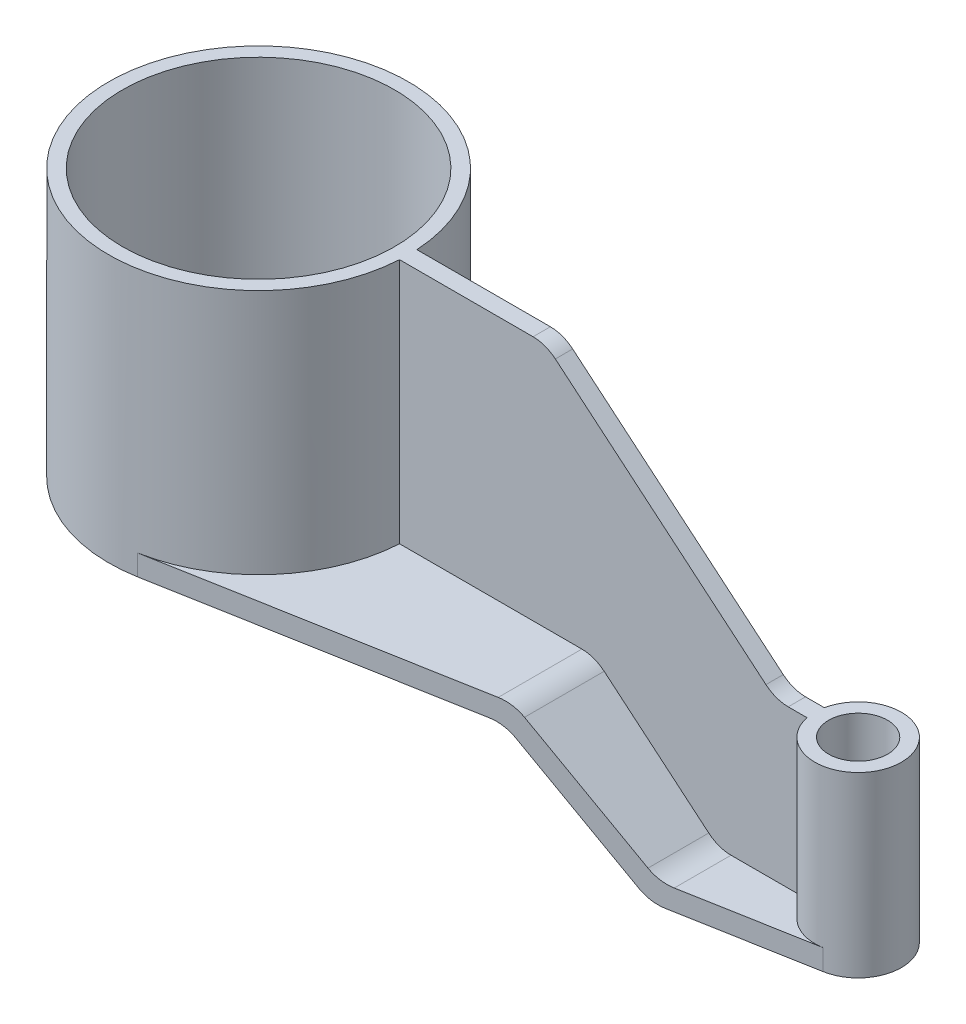
ISO-10303-21;
HEADER;
FILE_DESCRIPTION(('STEP AP214'),'2;1');
FILE_NAME('part.step','',(''),(''),'','','');
FILE_SCHEMA(('AUTOMOTIVE_DESIGN { 1 0 10303 214 1 1 1 1 }'));
ENDSEC;
DATA;
#1=APPLICATION_CONTEXT('core data for automotive mechanical design processes');
#2=APPLICATION_PROTOCOL_DEFINITION('international standard','automotive_design',2000,#1);
#3=PRODUCT_CONTEXT('',#1,'mechanical');
#4=PRODUCT('Part','Part','',(#3));
#5=PRODUCT_RELATED_PRODUCT_CATEGORY('part','',(#4));
#6=PRODUCT_DEFINITION_FORMATION('','',#4);
#7=PRODUCT_DEFINITION_CONTEXT('part definition',#1,'design');
#8=PRODUCT_DEFINITION('design','',#6,#7);
#9=PRODUCT_DEFINITION_SHAPE('','',#8);
#10=(LENGTH_UNIT() NAMED_UNIT(*) SI_UNIT(.MILLI.,.METRE.));
#11=(NAMED_UNIT(*) PLANE_ANGLE_UNIT() SI_UNIT($,.RADIAN.));
#12=(NAMED_UNIT(*) SI_UNIT($,.STERADIAN.) SOLID_ANGLE_UNIT());
#13=UNCERTAINTY_MEASURE_WITH_UNIT(LENGTH_MEASURE(1.E-05),#10,'distance_accuracy_value','');
#14=(GEOMETRIC_REPRESENTATION_CONTEXT(3) GLOBAL_UNCERTAINTY_ASSIGNED_CONTEXT((#13)) GLOBAL_UNIT_ASSIGNED_CONTEXT((#10,
#11,#12)) REPRESENTATION_CONTEXT('',''));
#15=CARTESIAN_POINT('',(0.,0.,0.));
#16=DIRECTION('',(0.,0.,1.));
#17=DIRECTION('',(1.,0.,0.));
#18=AXIS2_PLACEMENT_3D('',#15,#16,#17);
#19=CARTESIAN_POINT('',(-43.25,6.,115.));
#20=DIRECTION('',(0.,-1.,0.));
#21=DIRECTION('',(1.,0.,0.));
#22=AXIS2_PLACEMENT_3D('',#19,#20,#21);
#23=PLANE('',#22);
#24=DIRECTION('',(-1.,0.,0.));
#25=VECTOR('',#24,1.);
#26=CARTESIAN_POINT('',(-43.25,6.,-2.5));
#27=LINE('',#26,#25);
#28=CARTESIAN_POINT('',(95.7915112851085,6.,-2.5));
#29=VERTEX_POINT('',#28);
#30=CARTESIAN_POINT('',(43.1776852089132,6.00000000000001,-2.5));
#31=VERTEX_POINT('',#30);
#32=EDGE_CURVE('E239',#29,#31,#27,.T.);
#33=ORIENTED_EDGE('',*,*,#32,.F.);
#34=DIRECTION('',(0.,0.,-1.));
#35=VECTOR('',#34,1.);
#36=CARTESIAN_POINT('',(95.7915112851085,6.,115.));
#37=LINE('',#36,#35);
#38=CARTESIAN_POINT('',(95.7915112851085,6.,-26.6478014893455));
#39=VERTEX_POINT('',#38);
#40=EDGE_CURVE('E357',#29,#39,#37,.T.);
#41=ORIENTED_EDGE('',*,*,#40,.T.);
#42=DIRECTION('',(-0.984076459766301,0.,-0.177745664739884));
#43=VECTOR('',#42,1.);
#44=CARTESIAN_POINT('',(-14.0808178852683,6.,-46.4931397159563));
#45=LINE('',#44,#43);
#46=CARTESIAN_POINT('',(7.6875,5.99999999999999,-42.5613068848925));
#47=VERTEX_POINT('',#46);
#48=EDGE_CURVE('E286',#39,#47,#45,.T.);
#49=ORIENTED_EDGE('',*,*,#48,.T.);
#50=CARTESIAN_POINT('',(0.,6.00000000000001,0.));
#51=DIRECTION('',(0.,-1.,0.));
#52=DIRECTION('',(1.,0.,0.));
#53=AXIS2_PLACEMENT_3D('',#50,#51,#52);
#54=CIRCLE('',#53,43.25);
#55=EDGE_CURVE('E305',#47,#31,#54,.T.);
#56=ORIENTED_EDGE('',*,*,#55,.T.);
#57=EDGE_LOOP('',(#33,#41,#49,#56));
#58=FACE_BOUND('',#57,.T.);
#59=ADVANCED_FACE('F37',(#58),#23,.F.);
#60=CARTESIAN_POINT('',(185.5,-24.,115.));
#61=DIRECTION('',(0.,-1.,0.));
#62=DIRECTION('',(1.,0.,0.));
#63=AXIS2_PLACEMENT_3D('',#60,#61,#62);
#64=PLANE('',#63);
#65=DIRECTION('',(-0.984076459766301,0.,-0.177745664739884));
#66=VECTOR('',#65,1.);
#67=CARTESIAN_POINT('',(207.44216410962,-24.,-6.48125923748866));
#68=LINE('',#67,#66);
#69=CARTESIAN_POINT('',(175.221820809249,-24.,-12.3009557470788));
#70=VERTEX_POINT('',#69);
#71=CARTESIAN_POINT('',(138.823523748259,-24.,-18.875281798981));
#72=VERTEX_POINT('',#71);
#73=EDGE_CURVE('E283',#70,#72,#68,.T.);
#74=ORIENTED_EDGE('',*,*,#73,.T.);
#75=DIRECTION('',(0.,0.,-1.));
#76=VECTOR('',#75,1.);
#77=CARTESIAN_POINT('',(138.823523748259,-24.,-2.5));
#78=LINE('',#77,#76);
#79=CARTESIAN_POINT('',(138.823523748259,-24.,-2.5));
#80=VERTEX_POINT('',#79);
#81=EDGE_CURVE('E364',#72,#80,#78,.F.);
#82=ORIENTED_EDGE('',*,*,#81,.T.);
#83=DIRECTION('',(-1.,0.,0.));
#84=VECTOR('',#83,1.);
#85=CARTESIAN_POINT('',(185.5,-24.,-2.5));
#86=LINE('',#85,#84);
#87=CARTESIAN_POINT('',(160.752551286084,-24.,-2.5));
#88=VERTEX_POINT('',#87);
#89=EDGE_CURVE('E228',#88,#80,#86,.T.);
#90=ORIENTED_EDGE('',*,*,#89,.F.);
#91=CARTESIAN_POINT('',(173.,-24.,0.));
#92=DIRECTION('',(0.,-1.,0.));
#93=DIRECTION('',(1.,0.,0.));
#94=AXIS2_PLACEMENT_3D('',#91,#92,#93);
#95=CIRCLE('',#94,12.5);
#96=EDGE_CURVE('E227',#70,#88,#95,.F.);
#97=ORIENTED_EDGE('',*,*,#96,.F.);
#98=EDGE_LOOP('',(#74,#82,#90,#97));
#99=FACE_BOUND('',#98,.T.);
#100=ADVANCED_FACE('F467',(#99),#64,.F.);
#101=CARTESIAN_POINT('',(136.856725658119,-25.4037333412861,115.));
#102=DIRECTION('',(-0.642787609686535,-0.766044443118982,0.));
#103=DIRECTION('',(0.766044443118982,-0.642787609686535,0.));
#104=AXIS2_PLACEMENT_3D('',#101,#102,#103);
#105=PLANE('',#104);
#106=DIRECTION('',(-0.758815239000417,0.636721587176942,-0.137058576833465));
#107=VECTOR('',#106,1.);
#108=CARTESIAN_POINT('',(150.816987428788,-37.1177838441927,-16.7090007612906));
#109=LINE('',#108,#107);
#110=CARTESIAN_POINT('',(132.395647651394,-21.6604444311898,-20.0362963709324));
#111=VERTEX_POINT('',#110);
#112=CARTESIAN_POINT('',(102.219387381974,3.66044443118979,-25.4867869173942));
#113=VERTEX_POINT('',#112);
#114=EDGE_CURVE('E281',#111,#113,#109,.T.);
#115=ORIENTED_EDGE('',*,*,#114,.T.);
#116=DIRECTION('',(0.,0.,-1.));
#117=VECTOR('',#116,1.);
#118=CARTESIAN_POINT('',(102.219387381974,3.66044443118982,115.));
#119=LINE('',#118,#117);
#120=CARTESIAN_POINT('',(102.219387381974,3.66044443118982,-2.5));
#121=VERTEX_POINT('',#120);
#122=EDGE_CURVE('E52',#113,#121,#119,.F.);
#123=ORIENTED_EDGE('',*,*,#122,.T.);
#124=DIRECTION('',(-0.766044443118982,0.642787609686535,0.));
#125=VECTOR('',#124,1.);
#126=CARTESIAN_POINT('',(136.856725658119,-25.4037333412861,-2.5));
#127=LINE('',#126,#125);
#128=CARTESIAN_POINT('',(132.395647651394,-21.6604444311898,-2.5));
#129=VERTEX_POINT('',#128);
#130=EDGE_CURVE('E231',#129,#121,#127,.T.);
#131=ORIENTED_EDGE('',*,*,#130,.F.);
#132=DIRECTION('',(0.,0.,-1.));
#133=VECTOR('',#132,1.);
#134=CARTESIAN_POINT('',(132.395647651394,-21.6604444311898,-19.5326913995576));
#135=LINE('',#134,#133);
#136=EDGE_CURVE('E360',#129,#111,#135,.T.);
#137=ORIENTED_EDGE('',*,*,#136,.T.);
#138=EDGE_LOOP('',(#115,#123,#131,#137));
#139=FACE_BOUND('',#138,.T.);
#140=ADVANCED_FACE('F459',(#139),#105,.F.);
#141=CARTESIAN_POINT('',(0.,77.,0.));
#142=DIRECTION('',(0.,1.,0.));
#143=DIRECTION('',(0.,0.,1.));
#144=AXIS2_PLACEMENT_3D('',#141,#142,#143);
#145=PLANE('',#144);
#146=CARTESIAN_POINT('',(0.,77.,0.));
#147=DIRECTION('',(0.,1.,0.));
#148=DIRECTION('',(0.,0.,1.));
#149=AXIS2_PLACEMENT_3D('',#146,#147,#148);
#150=CIRCLE('',#149,39.25);
#151=CARTESIAN_POINT('',(0.,77.,39.25));
#152=VERTEX_POINT('',#151);
#153=EDGE_CURVE('E320',#152,#152,#150,.T.);
#154=ORIENTED_EDGE('',*,*,#153,.F.);
#155=EDGE_LOOP('',(#154));
#156=FACE_BOUND('',#155,.T.);
#157=DIRECTION('',(1.,0.,0.));
#158=VECTOR('',#157,1.);
#159=CARTESIAN_POINT('',(71.125,77.,2.5));
#160=LINE('',#159,#158);
#161=CARTESIAN_POINT('',(81.703153028591,77.,2.5));
#162=VERTEX_POINT('',#161);
#163=CARTESIAN_POINT('',(43.1776852089132,77.,2.5));
#164=VERTEX_POINT('',#163);
#165=EDGE_CURVE('E229',#162,#164,#160,.F.);
#166=ORIENTED_EDGE('',*,*,#165,.F.);
#167=DIRECTION('',(0.,0.,1.));
#168=VECTOR('',#167,1.);
#169=CARTESIAN_POINT('',(81.703153028591,77.,0.));
#170=LINE('',#169,#168);
#171=CARTESIAN_POINT('',(81.703153028591,77.,-2.5));
#172=VERTEX_POINT('',#171);
#173=EDGE_CURVE('E350',#162,#172,#170,.F.);
#174=ORIENTED_EDGE('',*,*,#173,.T.);
#175=DIRECTION('',(1.,0.,0.));
#176=VECTOR('',#175,1.);
#177=CARTESIAN_POINT('',(71.125,77.,-2.5));
#178=LINE('',#177,#176);
#179=CARTESIAN_POINT('',(43.1776852089132,77.,-2.5));
#180=VERTEX_POINT('',#179);
#181=EDGE_CURVE('E236',#172,#180,#178,.F.);
#182=ORIENTED_EDGE('',*,*,#181,.T.);
#183=CARTESIAN_POINT('',(0.,77.,0.));
#184=DIRECTION('',(0.,1.,0.));
#185=DIRECTION('',(0.,0.,1.));
#186=AXIS2_PLACEMENT_3D('',#183,#184,#185);
#187=CIRCLE('',#186,43.25);
#188=EDGE_CURVE('E211',#180,#164,#187,.T.);
#189=ORIENTED_EDGE('',*,*,#188,.T.);
#190=EDGE_LOOP('',(#166,#174,#182,#189));
#191=FACE_BOUND('',#190,.T.);
#192=ADVANCED_FACE('F451',(#156,#191),#145,.T.);
#193=DIRECTION('',(-0.984076459766301,0.,0.177745664739884));
#194=VECTOR('',#193,1.);
#195=CARTESIAN_POINT('',(-54.311342519356,6.,53.7596496227356));
#196=LINE('',#195,#194);
#197=CARTESIAN_POINT('',(95.7915112851085,6.,26.6478014893455));
#198=VERTEX_POINT('',#197);
#199=CARTESIAN_POINT('',(7.6875,5.99999999999999,42.5613068848925));
#200=VERTEX_POINT('',#199);
#201=EDGE_CURVE('E300',#198,#200,#196,.T.);
#202=ORIENTED_EDGE('',*,*,#201,.F.);
#203=DIRECTION('',(0.,0.,-1.));
#204=VECTOR('',#203,1.);
#205=CARTESIAN_POINT('',(95.7915112851085,6.,115.));
#206=LINE('',#205,#204);
#207=CARTESIAN_POINT('',(95.7915112851085,6.,2.5));
#208=VERTEX_POINT('',#207);
#209=EDGE_CURVE('E373',#198,#208,#206,.T.);
#210=ORIENTED_EDGE('',*,*,#209,.T.);
#211=DIRECTION('',(-1.,0.,0.));
#212=VECTOR('',#211,1.);
#213=CARTESIAN_POINT('',(-43.25,6.,2.5));
#214=LINE('',#213,#212);
#215=CARTESIAN_POINT('',(43.1776852089132,6.00000000000001,2.5));
#216=VERTEX_POINT('',#215);
#217=EDGE_CURVE('E252',#208,#216,#214,.T.);
#218=ORIENTED_EDGE('',*,*,#217,.T.);
#219=EDGE_CURVE('E304',#216,#200,#54,.T.);
#220=ORIENTED_EDGE('',*,*,#219,.T.);
#221=EDGE_LOOP('',(#202,#210,#218,#220));
#222=FACE_BOUND('',#221,.T.);
#223=ADVANCED_FACE('F443',(#222),#23,.F.);
#224=DIRECTION('',(-1.,0.,0.));
#225=VECTOR('',#224,1.);
#226=CARTESIAN_POINT('',(185.5,-24.,2.5));
#227=LINE('',#226,#225);
#228=CARTESIAN_POINT('',(160.752551286084,-24.,2.5));
#229=VERTEX_POINT('',#228);
#230=CARTESIAN_POINT('',(138.823523748259,-24.,2.5));
#231=VERTEX_POINT('',#230);
#232=EDGE_CURVE('E246',#229,#231,#227,.T.);
#233=ORIENTED_EDGE('',*,*,#232,.T.);
#234=DIRECTION('',(0.,0.,-1.));
#235=VECTOR('',#234,1.);
#236=CARTESIAN_POINT('',(138.823523748259,-24.,19.5326913995576));
#237=LINE('',#236,#235);
#238=CARTESIAN_POINT('',(138.823523748259,-24.,18.875281798981));
#239=VERTEX_POINT('',#238);
#240=EDGE_CURVE('E371',#231,#239,#237,.F.);
#241=ORIENTED_EDGE('',*,*,#240,.T.);
#242=DIRECTION('',(-0.984076459766301,0.,0.177745664739884));
#243=VECTOR('',#242,1.);
#244=CARTESIAN_POINT('',(167.211639475532,-24.,13.747769144268));
#245=LINE('',#244,#243);
#246=CARTESIAN_POINT('',(175.221820809248,-24.,12.3009557470788));
#247=VERTEX_POINT('',#246);
#248=EDGE_CURVE('E297',#247,#239,#245,.T.);
#249=ORIENTED_EDGE('',*,*,#248,.F.);
#250=EDGE_CURVE('E308',#229,#247,#95,.F.);
#251=ORIENTED_EDGE('',*,*,#250,.F.);
#252=EDGE_LOOP('',(#233,#241,#249,#251));
#253=FACE_BOUND('',#252,.T.);
#254=ADVANCED_FACE('F406',(#253),#64,.F.);
#255=DIRECTION('',(-0.758815239000417,0.636721587176942,0.137058576833465));
#256=VECTOR('',#255,1.);
#257=CARTESIAN_POINT('',(126.896495979291,-17.0461082913409,21.0295630625219));
#258=LINE('',#257,#256);
#259=CARTESIAN_POINT('',(132.395647651394,-21.6604444311898,20.0362963709323));
#260=VERTEX_POINT('',#259);
#261=CARTESIAN_POINT('',(102.219387381974,3.6604444311898,25.4867869173941));
#262=VERTEX_POINT('',#261);
#263=EDGE_CURVE('E294',#260,#262,#258,.T.);
#264=ORIENTED_EDGE('',*,*,#263,.F.);
#265=DIRECTION('',(0.,0.,-1.));
#266=VECTOR('',#265,1.);
#267=CARTESIAN_POINT('',(132.395647651394,-21.6604444311898,2.5));
#268=LINE('',#267,#266);
#269=CARTESIAN_POINT('',(132.395647651394,-21.6604444311898,2.5));
#270=VERTEX_POINT('',#269);
#271=EDGE_CURVE('E368',#260,#270,#268,.T.);
#272=ORIENTED_EDGE('',*,*,#271,.T.);
#273=DIRECTION('',(-0.766044443118982,0.642787609686535,0.));
#274=VECTOR('',#273,1.);
#275=CARTESIAN_POINT('',(136.856725658119,-25.4037333412861,2.5));
#276=LINE('',#275,#274);
#277=CARTESIAN_POINT('',(102.219387381974,3.66044443118982,2.5));
#278=VERTEX_POINT('',#277);
#279=EDGE_CURVE('E249',#270,#278,#276,.T.);
#280=ORIENTED_EDGE('',*,*,#279,.T.);
#281=DIRECTION('',(0.,0.,-1.));
#282=VECTOR('',#281,1.);
#283=CARTESIAN_POINT('',(102.219387381974,3.66044443118982,115.));
#284=LINE('',#283,#282);
#285=EDGE_CURVE('E366',#278,#262,#284,.F.);
#286=ORIENTED_EDGE('',*,*,#285,.T.);
#287=EDGE_LOOP('',(#264,#272,#280,#286));
#288=FACE_BOUND('',#287,.T.);
#289=ADVANCED_FACE('F397',(#288),#105,.F.);
#290=CARTESIAN_POINT('',(0.,77.,0.));
#291=DIRECTION('',(0.,-1.,0.));
#292=DIRECTION('',(0.,0.,-1.));
#293=AXIS2_PLACEMENT_3D('',#290,#291,#292);
#294=CYLINDRICAL_SURFACE('',#293,43.25);
#295=DIRECTION('',(0.,-1.,0.));
#296=VECTOR('',#295,1.);
#297=CARTESIAN_POINT('',(43.1776852089132,77.,2.5));
#298=LINE('',#297,#296);
#299=EDGE_CURVE('E254',#216,#164,#298,.F.);
#300=ORIENTED_EDGE('',*,*,#299,.T.);
#301=ORIENTED_EDGE('',*,*,#188,.F.);
#302=DIRECTION('',(0.,-1.,0.));
#303=VECTOR('',#302,1.);
#304=CARTESIAN_POINT('',(43.1776852089132,77.,-2.5));
#305=LINE('',#304,#303);
#306=EDGE_CURVE('E241',#31,#180,#305,.F.);
#307=ORIENTED_EDGE('',*,*,#306,.F.);
#308=ORIENTED_EDGE('',*,*,#55,.F.);
#309=DIRECTION('',(0.,1.,0.));
#310=VECTOR('',#309,1.);
#311=CARTESIAN_POINT('',(7.6875,-30.,-42.5613068848925));
#312=LINE('',#311,#310);
#313=CARTESIAN_POINT('',(7.6875,0.,-42.5613068848925));
#314=VERTEX_POINT('',#313);
#315=EDGE_CURVE('E272',#314,#47,#312,.T.);
#316=ORIENTED_EDGE('',*,*,#315,.F.);
#317=CARTESIAN_POINT('',(0.,0.,0.));
#318=DIRECTION('',(0.,1.,0.));
#319=DIRECTION('',(0.,0.,1.));
#320=AXIS2_PLACEMENT_3D('',#317,#318,#319);
#321=CIRCLE('',#320,43.25);
#322=CARTESIAN_POINT('',(7.6875,0.,42.5613068848925));
#323=VERTEX_POINT('',#322);
#324=EDGE_CURVE('E313',#314,#323,#321,.T.);
#325=ORIENTED_EDGE('',*,*,#324,.T.);
#326=DIRECTION('',(0.,1.,0.));
#327=VECTOR('',#326,1.);
#328=CARTESIAN_POINT('',(7.6875,-30.,42.5613068848925));
#329=LINE('',#328,#327);
#330=EDGE_CURVE('E269',#323,#200,#329,.T.);
#331=ORIENTED_EDGE('',*,*,#330,.T.);
#332=ORIENTED_EDGE('',*,*,#219,.F.);
#333=EDGE_LOOP('',(#300,#301,#307,#308,#316,#325,#331,#332));
#334=FACE_BOUND('',#333,.T.);
#335=ADVANCED_FACE('F436',(#334),#294,.T.);
#336=CARTESIAN_POINT('',(173.,21.3333333333333,0.));
#337=DIRECTION('',(0.,-1.,0.));
#338=DIRECTION('',(0.,0.,-1.));
#339=AXIS2_PLACEMENT_3D('',#336,#337,#338);
#340=CYLINDRICAL_SURFACE('',#339,12.5);
#341=CARTESIAN_POINT('',(173.,21.3333333333333,0.));
#342=DIRECTION('',(0.,1.,0.));
#343=DIRECTION('',(0.,0.,1.));
#344=AXIS2_PLACEMENT_3D('',#341,#342,#343);
#345=CIRCLE('',#344,12.5);
#346=CARTESIAN_POINT('',(160.752551286084,21.3333333333333,2.5));
#347=VERTEX_POINT('',#346);
#348=CARTESIAN_POINT('',(160.752551286084,21.3333333333333,-2.5));
#349=VERTEX_POINT('',#348);
#350=EDGE_CURVE('E199',#347,#349,#345,.T.);
#351=ORIENTED_EDGE('',*,*,#350,.F.);
#352=DIRECTION('',(0.,-1.,0.));
#353=VECTOR('',#352,1.);
#354=CARTESIAN_POINT('',(160.752551286084,21.3333333333333,2.5));
#355=LINE('',#354,#353);
#356=EDGE_CURVE('E244',#347,#229,#355,.T.);
#357=ORIENTED_EDGE('',*,*,#356,.T.);
#358=ORIENTED_EDGE('',*,*,#250,.T.);
#359=DIRECTION('',(0.,1.,0.));
#360=VECTOR('',#359,1.);
#361=CARTESIAN_POINT('',(175.221820809248,-30.,12.3009557470788));
#362=LINE('',#361,#360);
#363=CARTESIAN_POINT('',(175.221820809248,-30.,12.3009557470788));
#364=VERTEX_POINT('',#363);
#365=EDGE_CURVE('E265',#364,#247,#362,.T.);
#366=ORIENTED_EDGE('',*,*,#365,.F.);
#367=CARTESIAN_POINT('',(173.,-30.,0.));
#368=DIRECTION('',(0.,1.,0.));
#369=DIRECTION('',(0.,0.,1.));
#370=AXIS2_PLACEMENT_3D('',#367,#368,#369);
#371=CIRCLE('',#370,12.5);
#372=CARTESIAN_POINT('',(175.221820809249,-30.,-12.3009557470788));
#373=VERTEX_POINT('',#372);
#374=EDGE_CURVE('E257',#364,#373,#371,.T.);
#375=ORIENTED_EDGE('',*,*,#374,.T.);
#376=DIRECTION('',(0.,1.,0.));
#377=VECTOR('',#376,1.);
#378=CARTESIAN_POINT('',(175.221820809249,-30.,-12.3009557470788));
#379=LINE('',#378,#377);
#380=EDGE_CURVE('E264',#373,#70,#379,.T.);
#381=ORIENTED_EDGE('',*,*,#380,.T.);
#382=ORIENTED_EDGE('',*,*,#96,.T.);
#383=DIRECTION('',(0.,-1.,0.));
#384=VECTOR('',#383,1.);
#385=CARTESIAN_POINT('',(160.752551286084,21.3333333333333,-2.5));
#386=LINE('',#385,#384);
#387=EDGE_CURVE('E216',#349,#88,#386,.T.);
#388=ORIENTED_EDGE('',*,*,#387,.F.);
#389=EDGE_LOOP('',(#351,#357,#358,#366,#375,#381,#382,#388));
#390=FACE_BOUND('',#389,.T.);
#391=ADVANCED_FACE('F224',(#390),#340,.T.);
#392=CARTESIAN_POINT('',(173.,21.3333333333333,0.));
#393=DIRECTION('',(0.,1.,0.));
#394=DIRECTION('',(0.,0.,1.));
#395=AXIS2_PLACEMENT_3D('',#392,#393,#394);
#396=PLANE('',#395);
#397=CARTESIAN_POINT('',(173.,21.3333333333333,0.));
#398=DIRECTION('',(0.,1.,0.));
#399=DIRECTION('',(0.,0.,1.));
#400=AXIS2_PLACEMENT_3D('',#397,#398,#399);
#401=CIRCLE('',#400,8.50000000000001);
#402=CARTESIAN_POINT('',(173.,21.3333333333333,8.50000000000001));
#403=VERTEX_POINT('',#402);
#404=EDGE_CURVE('E310',#403,#403,#401,.T.);
#405=ORIENTED_EDGE('',*,*,#404,.F.);
#406=EDGE_LOOP('',(#405));
#407=FACE_BOUND('',#406,.T.);
#408=DIRECTION('',(1.,0.,0.));
#409=VECTOR('',#408,1.);
#410=CARTESIAN_POINT('',(71.125,21.3333333333333,-2.5));
#411=LINE('',#410,#409);
#412=CARTESIAN_POINT('',(155.32350770166,21.3333333333333,-2.5));
#413=VERTEX_POINT('',#412);
#414=EDGE_CURVE('E203',#349,#413,#411,.F.);
#415=ORIENTED_EDGE('',*,*,#414,.T.);
#416=DIRECTION('',(0.,0.,1.));
#417=VECTOR('',#416,1.);
#418=CARTESIAN_POINT('',(155.32350770166,21.3333333333333,2.5));
#419=LINE('',#418,#417);
#420=CARTESIAN_POINT('',(155.32350770166,21.3333333333333,2.5));
#421=VERTEX_POINT('',#420);
#422=EDGE_CURVE('E355',#413,#421,#419,.T.);
#423=ORIENTED_EDGE('',*,*,#422,.T.);
#424=DIRECTION('',(1.,0.,0.));
#425=VECTOR('',#424,1.);
#426=CARTESIAN_POINT('',(71.125,21.3333333333333,2.5));
#427=LINE('',#426,#425);
#428=EDGE_CURVE('E206',#347,#421,#427,.F.);
#429=ORIENTED_EDGE('',*,*,#428,.F.);
#430=ORIENTED_EDGE('',*,*,#350,.T.);
#431=EDGE_LOOP('',(#415,#423,#429,#430));
#432=FACE_BOUND('',#431,.T.);
#433=ADVANCED_FACE('F201',(#407,#432),#396,.T.);
#434=CARTESIAN_POINT('',(173.,-30.,0.));
#435=DIRECTION('',(0.,1.,0.));
#436=DIRECTION('',(0.,0.,1.));
#437=AXIS2_PLACEMENT_3D('',#434,#435,#436);
#438=CYLINDRICAL_SURFACE('',#437,8.50000000000001);
#439=CARTESIAN_POINT('',(173.,-30.,0.));
#440=DIRECTION('',(0.,-1.,0.));
#441=DIRECTION('',(1.,0.,0.));
#442=AXIS2_PLACEMENT_3D('',#439,#440,#441);
#443=CIRCLE('',#442,8.50000000000001);
#444=CARTESIAN_POINT('',(173.,-30.,8.50000000000001));
#445=VERTEX_POINT('',#444);
#446=EDGE_CURVE('E315',#445,#445,#443,.T.);
#447=CARTESIAN_POINT('',(173.,-30.,8.50000000000001));
#448=CARTESIAN_POINT('',(173.,-29.4652777777778,8.50000000000001));
#449=CARTESIAN_POINT('',(173.,-28.9305555555556,8.50000000000001));
#450=CARTESIAN_POINT('',(173.,-27.8611111111111,8.50000000000001));
#451=CARTESIAN_POINT('',(173.,-27.3263888888889,8.50000000000001));
#452=CARTESIAN_POINT('',(173.,-26.2569444444444,8.50000000000001));
#453=CARTESIAN_POINT('',(173.,-25.7222222222222,8.50000000000001));
#454=CARTESIAN_POINT('',(173.,-24.6527777777778,8.50000000000001));
#455=CARTESIAN_POINT('',(173.,-24.1180555555556,8.50000000000001));
#456=CARTESIAN_POINT('',(173.,-23.0486111111111,8.50000000000001));
#457=CARTESIAN_POINT('',(173.,-22.5138888888889,8.50000000000001));
#458=CARTESIAN_POINT('',(173.,-21.4444444444444,8.50000000000001));
#459=CARTESIAN_POINT('',(173.,-20.9097222222222,8.50000000000001));
#460=CARTESIAN_POINT('',(173.,-19.8402777777778,8.50000000000001));
#461=CARTESIAN_POINT('',(173.,-19.3055555555556,8.50000000000001));
#462=CARTESIAN_POINT('',(173.,-18.2361111111111,8.50000000000001));
#463=CARTESIAN_POINT('',(173.,-17.7013888888889,8.50000000000001));
#464=CARTESIAN_POINT('',(173.,-16.6319444444444,8.50000000000001));
#465=CARTESIAN_POINT('',(173.,-16.0972222222222,8.50000000000001));
#466=CARTESIAN_POINT('',(173.,-15.0277777777778,8.50000000000001));
#467=CARTESIAN_POINT('',(173.,-14.4930555555556,8.50000000000001));
#468=CARTESIAN_POINT('',(173.,-13.4236111111111,8.50000000000001));
#469=CARTESIAN_POINT('',(173.,-12.8888888888889,8.50000000000001));
#470=CARTESIAN_POINT('',(173.,-11.8194444444444,8.50000000000001));
#471=CARTESIAN_POINT('',(173.,-11.2847222222222,8.50000000000001));
#472=CARTESIAN_POINT('',(173.,-10.2152777777778,8.50000000000001));
#473=CARTESIAN_POINT('',(173.,-9.68055555555556,8.50000000000001));
#474=CARTESIAN_POINT('',(173.,-8.61111111111111,8.50000000000001));
#475=CARTESIAN_POINT('',(173.,-8.07638888888889,8.50000000000001));
#476=CARTESIAN_POINT('',(173.,-7.00694444444444,8.50000000000001));
#477=CARTESIAN_POINT('',(173.,-6.47222222222222,8.50000000000001));
#478=CARTESIAN_POINT('',(173.,-5.40277777777778,8.50000000000001));
#479=CARTESIAN_POINT('',(173.,-4.86805555555555,8.50000000000001));
#480=CARTESIAN_POINT('',(173.,-3.79861111111111,8.50000000000001));
#481=CARTESIAN_POINT('',(173.,-3.26388888888889,8.50000000000001));
#482=CARTESIAN_POINT('',(173.,-2.19444444444444,8.50000000000001));
#483=CARTESIAN_POINT('',(173.,-1.65972222222222,8.50000000000001));
#484=CARTESIAN_POINT('',(173.,-0.590277777777775,8.50000000000001));
#485=CARTESIAN_POINT('',(173.,-0.0555555555555531,8.50000000000001));
#486=CARTESIAN_POINT('',(173.,1.01388888888889,8.50000000000001));
#487=CARTESIAN_POINT('',(173.,1.54861111111111,8.50000000000001));
#488=CARTESIAN_POINT('',(173.,2.61805555555555,8.50000000000001));
#489=CARTESIAN_POINT('',(173.,3.15277777777778,8.50000000000001));
#490=CARTESIAN_POINT('',(173.,4.22222222222222,8.50000000000001));
#491=CARTESIAN_POINT('',(173.,4.75694444444444,8.50000000000001));
#492=CARTESIAN_POINT('',(173.,5.82638888888889,8.50000000000001));
#493=CARTESIAN_POINT('',(173.,6.36111111111111,8.50000000000001));
#494=CARTESIAN_POINT('',(173.,7.43055555555555,8.50000000000001));
#495=CARTESIAN_POINT('',(173.,7.96527777777778,8.50000000000001));
#496=CARTESIAN_POINT('',(173.,9.03472222222222,8.50000000000001));
#497=CARTESIAN_POINT('',(173.,9.56944444444444,8.50000000000001));
#498=CARTESIAN_POINT('',(173.,10.6388888888889,8.50000000000001));
#499=CARTESIAN_POINT('',(173.,11.1736111111111,8.50000000000001));
#500=CARTESIAN_POINT('',(173.,12.2430555555556,8.50000000000001));
#501=CARTESIAN_POINT('',(173.,12.7777777777778,8.50000000000001));
#502=CARTESIAN_POINT('',(173.,13.8472222222222,8.50000000000001));
#503=CARTESIAN_POINT('',(173.,14.3819444444444,8.50000000000001));
#504=CARTESIAN_POINT('',(173.,15.4513888888889,8.50000000000001));
#505=CARTESIAN_POINT('',(173.,15.9861111111111,8.50000000000001));
#506=CARTESIAN_POINT('',(173.,17.0555555555556,8.50000000000001));
#507=CARTESIAN_POINT('',(173.,17.5902777777778,8.50000000000001));
#508=CARTESIAN_POINT('',(173.,18.6597222222222,8.50000000000001));
#509=CARTESIAN_POINT('',(173.,19.1944444444444,8.50000000000001));
#510=CARTESIAN_POINT('',(173.,20.2638888888889,8.50000000000001));
#511=CARTESIAN_POINT('',(173.,20.7986111111111,8.50000000000001));
#512=CARTESIAN_POINT('',(173.,21.3333333333333,8.50000000000001));
#513=B_SPLINE_CURVE_WITH_KNOTS('',3,(#447,#448,#449,#450,#451,#452,#453,#454,#455,#456,#457,
#458,#459,#460,#461,#462,#463,#464,#465,#466,#467,#468,#469,#470,#471,#472,#473,#474,#475,#476,
#477,#478,#479,#480,#481,#482,#483,#484,#485,#486,#487,#488,#489,#490,#491,#492,#493,#494,#495,
#496,#497,#498,#499,#500,#501,#502,#503,#504,#505,#506,#507,#508,#509,#510,#511,#512),
.UNSPECIFIED.,.F.,.F.,(4,2,2,2,2,2,2,2,2,2,2,2,2,2,2,2,2,2,2,2,2,2,2,2,2,2,2,2,2,2,2,2,4),(0.,
1.60416666666666,3.20833333333333,4.8125,6.41666666666666,8.02083333333333,9.625,
11.2291666666667,12.8333333333333,14.4375,16.0416666666667,17.6458333333333,19.25,
20.8541666666667,22.4583333333333,24.0625,25.6666666666667,27.2708333333333,28.875,
30.4791666666667,32.0833333333333,33.6875,35.2916666666667,36.8958333333333,38.5,
40.1041666666667,41.7083333333333,43.3125,44.9166666666667,46.5208333333333,48.125,
49.7291666666667,51.3333333333333),.UNSPECIFIED.);
#514=EDGE_CURVE('BSEAM491',#445,#403,#513,.T.);
#515=ORIENTED_EDGE('',*,*,#446,.T.);
#516=ORIENTED_EDGE('',*,*,#404,.T.);
#517=ORIENTED_EDGE('',*,*,#514,.T.);
#518=ORIENTED_EDGE('',*,*,#514,.F.);
#519=EDGE_LOOP('',(#515,#517,#516,#518));
#520=FACE_BOUND('',#519,.T.);
#521=ADVANCED_FACE('F491',(#520),#438,.F.);
#522=CARTESIAN_POINT('',(0.,0.,0.));
#523=DIRECTION('',(0.,1.,0.));
#524=DIRECTION('',(0.,0.,1.));
#525=AXIS2_PLACEMENT_3D('',#522,#523,#524);
#526=PLANE('',#525);
#527=CARTESIAN_POINT('',(0.,0.,0.));
#528=DIRECTION('',(0.,1.,0.));
#529=DIRECTION('',(0.,0.,1.));
#530=AXIS2_PLACEMENT_3D('',#527,#528,#529);
#531=CIRCLE('',#530,39.25);
#532=CARTESIAN_POINT('',(0.,0.,39.25));
#533=VERTEX_POINT('',#532);
#534=EDGE_CURVE('E212',#533,#533,#531,.T.);
#535=ORIENTED_EDGE('',*,*,#534,.T.);
#536=EDGE_LOOP('',(#535));
#537=FACE_BOUND('',#536,.T.);
#538=DIRECTION('',(0.984076459766301,0.,0.177745664739884));
#539=VECTOR('',#538,1.);
#540=CARTESIAN_POINT('',(7.6875,0.,-42.5613068848925));
#541=LINE('',#540,#539);
#542=CARTESIAN_POINT('',(93.6076898795113,0.,-27.0422472496914));
#543=VERTEX_POINT('',#542);
#544=EDGE_CURVE('E268',#314,#543,#541,.T.);
#545=ORIENTED_EDGE('',*,*,#544,.T.);
#546=DIRECTION('',(0.,0.,-1.));
#547=VECTOR('',#546,1.);
#548=CARTESIAN_POINT('',(93.6076898795113,0.,0.));
#549=LINE('',#548,#547);
#550=CARTESIAN_POINT('',(93.6076898795113,0.,27.0422472496914));
#551=VERTEX_POINT('',#550);
#552=EDGE_CURVE('E339',#543,#551,#549,.F.);
#553=ORIENTED_EDGE('',*,*,#552,.T.);
#554=DIRECTION('',(0.984076459766301,0.,-0.177745664739884));
#555=VECTOR('',#554,1.);
#556=CARTESIAN_POINT('',(7.6875,0.,42.5613068848925));
#557=LINE('',#556,#555);
#558=EDGE_CURVE('E288',#323,#551,#557,.T.);
#559=ORIENTED_EDGE('',*,*,#558,.F.);
#560=ORIENTED_EDGE('',*,*,#324,.F.);
#561=EDGE_LOOP('',(#545,#553,#559,#560));
#562=FACE_BOUND('',#561,.T.);
#563=ADVANCED_FACE('F432',(#537,#562),#526,.F.);
#564=CARTESIAN_POINT('',(185.5,-30.,115.));
#565=DIRECTION('',(0.,-1.,0.));
#566=DIRECTION('',(1.,0.,0.));
#567=AXIS2_PLACEMENT_3D('',#564,#565,#566);
#568=PLANE('',#567);
#569=ORIENTED_EDGE('',*,*,#446,.F.);
#570=EDGE_LOOP('',(#569));
#571=FACE_BOUND('',#570,.T.);
#572=DIRECTION('',(0.984076459766301,0.,-0.177745664739884));
#573=VECTOR('',#572,1.);
#574=CARTESIAN_POINT('',(7.6875,-30.,42.5613068848925));
#575=LINE('',#574,#573);
#576=CARTESIAN_POINT('',(136.639702342662,-30.,19.269727559327));
#577=VERTEX_POINT('',#576);
#578=EDGE_CURVE('E262',#577,#364,#575,.T.);
#579=ORIENTED_EDGE('',*,*,#578,.F.);
#580=DIRECTION('',(0.,0.,-1.));
#581=VECTOR('',#580,1.);
#582=CARTESIAN_POINT('',(136.639702342662,-30.,115.));
#583=LINE('',#582,#581);
#584=CARTESIAN_POINT('',(136.639702342662,-30.,-19.269727559327));
#585=VERTEX_POINT('',#584);
#586=EDGE_CURVE('E323',#577,#585,#583,.T.);
#587=ORIENTED_EDGE('',*,*,#586,.T.);
#588=DIRECTION('',(0.984076459766301,0.,0.177745664739884));
#589=VECTOR('',#588,1.);
#590=CARTESIAN_POINT('',(7.6875,-30.,-42.5613068848925));
#591=LINE('',#590,#589);
#592=EDGE_CURVE('E260',#585,#373,#591,.T.);
#593=ORIENTED_EDGE('',*,*,#592,.T.);
#594=ORIENTED_EDGE('',*,*,#374,.F.);
#595=EDGE_LOOP('',(#579,#587,#593,#594));
#596=FACE_BOUND('',#595,.T.);
#597=ADVANCED_FACE('F413',(#571,#596),#568,.T.);
#598=CARTESIAN_POINT('',(133.,-30.,115.));
#599=DIRECTION('',(-0.642787609686535,-0.766044443118982,0.));
#600=DIRECTION('',(0.766044443118982,-0.642787609686535,0.));
#601=AXIS2_PLACEMENT_3D('',#598,#599,#600);
#602=PLANE('',#601);
#603=DIRECTION('',(-0.758815239000417,0.636721587176942,-0.137058576833465));
#604=VECTOR('',#603,1.);
#605=CARTESIAN_POINT('',(147.032710568428,-41.7748422623857,-17.3925236719637));
#606=LINE('',#605,#604);
#607=CARTESIAN_POINT('',(130.211826245797,-27.6604444311898,-20.4307421312783));
#608=VERTEX_POINT('',#607);
#609=CARTESIAN_POINT('',(100.035565976377,-2.33955556881019,-25.8812326777401));
#610=VERTEX_POINT('',#609);
#611=EDGE_CURVE('E278',#608,#610,#606,.T.);
#612=ORIENTED_EDGE('',*,*,#611,.F.);
#613=DIRECTION('',(0.,0.,-1.));
#614=VECTOR('',#613,1.);
#615=CARTESIAN_POINT('',(130.211826245797,-27.6604444311898,115.));
#616=LINE('',#615,#614);
#617=CARTESIAN_POINT('',(130.211826245797,-27.6604444311898,20.4307421312783));
#618=VERTEX_POINT('',#617);
#619=EDGE_CURVE('E333',#608,#618,#616,.F.);
#620=ORIENTED_EDGE('',*,*,#619,.T.);
#621=DIRECTION('',(-0.758815239000417,0.636721587176942,0.137058576833465));
#622=VECTOR('',#621,1.);
#623=CARTESIAN_POINT('',(123.112219118932,-21.7031667095339,21.7130859731951));
#624=LINE('',#623,#622);
#625=CARTESIAN_POINT('',(100.035565976377,-2.33955556881018,25.8812326777401));
#626=VERTEX_POINT('',#625);
#627=EDGE_CURVE('E291',#618,#626,#624,.T.);
#628=ORIENTED_EDGE('',*,*,#627,.T.);
#629=DIRECTION('',(0.,0.,-1.));
#630=VECTOR('',#629,1.);
#631=CARTESIAN_POINT('',(100.035565976377,-2.33955556881018,115.));
#632=LINE('',#631,#630);
#633=EDGE_CURVE('E330',#626,#610,#632,.T.);
#634=ORIENTED_EDGE('',*,*,#633,.T.);
#635=EDGE_LOOP('',(#612,#620,#628,#634));
#636=FACE_BOUND('',#635,.T.);
#637=ADVANCED_FACE('F423',(#636),#602,.T.);
#638=CARTESIAN_POINT('',(7.6875,-30.,-42.5613068848925));
#639=DIRECTION('',(-0.177745664739884,0.,0.984076459766301));
#640=DIRECTION('',(0.984076459766301,0.,0.177745664739884));
#641=AXIS2_PLACEMENT_3D('',#638,#639,#640);
#642=PLANE('',#641);
#643=ORIENTED_EDGE('',*,*,#592,.F.);
#644=CARTESIAN_POINT('',(136.639702342662,-20.,-19.269727559327));
#645=DIRECTION('',(-0.177745664739884,0.,0.984076459766301));
#646=DIRECTION('',(-0.984076459766301,0.,-0.177745664739884));
#647=AXIS2_PLACEMENT_3D('',#644,#645,#646);
#648=ELLIPSE('',#647,10.161812022589,10.);
#649=EDGE_CURVE('E328',#585,#608,#648,.F.);
#650=ORIENTED_EDGE('',*,*,#649,.T.);
#651=ORIENTED_EDGE('',*,*,#611,.T.);
#652=CARTESIAN_POINT('',(93.6076898795113,-10.,-27.0422472496914));
#653=DIRECTION('',(-0.177745664739884,0.,0.984076459766301));
#654=DIRECTION('',(-0.984076459766301,0.,-0.177745664739884));
#655=AXIS2_PLACEMENT_3D('',#652,#653,#654);
#656=ELLIPSE('',#655,10.161812022589,10.);
#657=EDGE_CURVE('E376',#610,#543,#656,.T.);
#658=ORIENTED_EDGE('',*,*,#657,.T.);
#659=ORIENTED_EDGE('',*,*,#544,.F.);
#660=ORIENTED_EDGE('',*,*,#315,.T.);
#661=ORIENTED_EDGE('',*,*,#48,.F.);
#662=CARTESIAN_POINT('',(95.7915112851085,-4.,-26.6478014893455));
#663=DIRECTION('',(-0.177745664739884,0.,0.984076459766301));
#664=DIRECTION('',(-0.984076459766301,0.,-0.177745664739884));
#665=AXIS2_PLACEMENT_3D('',#662,#663,#664);
#666=ELLIPSE('',#665,10.161812022589,10.);
#667=EDGE_CURVE('E326',#39,#113,#666,.F.);
#668=ORIENTED_EDGE('',*,*,#667,.T.);
#669=ORIENTED_EDGE('',*,*,#114,.F.);
#670=CARTESIAN_POINT('',(138.823523748259,-14.,-18.875281798981));
#671=DIRECTION('',(-0.177745664739884,0.,0.984076459766301));
#672=DIRECTION('',(0.984076459766301,0.,0.177745664739884));
#673=AXIS2_PLACEMENT_3D('',#670,#671,#672);
#674=ELLIPSE('',#673,10.161812022589,10.);
#675=EDGE_CURVE('E385',#111,#72,#674,.T.);
#676=ORIENTED_EDGE('',*,*,#675,.T.);
#677=ORIENTED_EDGE('',*,*,#73,.F.);
#678=ORIENTED_EDGE('',*,*,#380,.F.);
#679=EDGE_LOOP('',(#643,#650,#651,#658,#659,#660,#661,#668,#669,#676,#677,#678));
#680=FACE_BOUND('',#679,.T.);
#681=ADVANCED_FACE('F420',(#680),#642,.F.);
#682=CARTESIAN_POINT('',(7.6875,-30.,42.5613068848925));
#683=DIRECTION('',(0.177745664739884,0.,0.984076459766301));
#684=DIRECTION('',(0.984076459766301,0.,-0.177745664739884));
#685=AXIS2_PLACEMENT_3D('',#682,#683,#684);
#686=PLANE('',#685);
#687=ORIENTED_EDGE('',*,*,#627,.F.);
#688=CARTESIAN_POINT('',(136.639702342662,-20.,19.269727559327));
#689=DIRECTION('',(0.177745664739884,0.,0.984076459766301));
#690=DIRECTION('',(0.984076459766301,0.,-0.177745664739884));
#691=AXIS2_PLACEMENT_3D('',#688,#689,#690);
#692=ELLIPSE('',#691,10.161812022589,10.);
#693=EDGE_CURVE('E337',#618,#577,#692,.T.);
#694=ORIENTED_EDGE('',*,*,#693,.T.);
#695=ORIENTED_EDGE('',*,*,#578,.T.);
#696=ORIENTED_EDGE('',*,*,#365,.T.);
#697=ORIENTED_EDGE('',*,*,#248,.T.);
#698=CARTESIAN_POINT('',(138.823523748259,-14.,18.875281798981));
#699=DIRECTION('',(0.177745664739884,0.,0.984076459766301));
#700=DIRECTION('',(-0.984076459766301,0.,0.177745664739884));
#701=AXIS2_PLACEMENT_3D('',#698,#699,#700);
#702=ELLIPSE('',#701,10.161812022589,10.);
#703=EDGE_CURVE('E45',#239,#260,#702,.F.);
#704=ORIENTED_EDGE('',*,*,#703,.T.);
#705=ORIENTED_EDGE('',*,*,#263,.T.);
#706=CARTESIAN_POINT('',(95.7915112851085,-4.,26.6478014893455));
#707=DIRECTION('',(0.177745664739884,0.,0.984076459766301));
#708=DIRECTION('',(0.984076459766301,0.,-0.177745664739884));
#709=AXIS2_PLACEMENT_3D('',#706,#707,#708);
#710=ELLIPSE('',#709,10.161812022589,10.);
#711=EDGE_CURVE('E335',#262,#198,#710,.T.);
#712=ORIENTED_EDGE('',*,*,#711,.T.);
#713=ORIENTED_EDGE('',*,*,#201,.T.);
#714=ORIENTED_EDGE('',*,*,#330,.F.);
#715=ORIENTED_EDGE('',*,*,#558,.T.);
#716=CARTESIAN_POINT('',(93.6076898795113,-10.,27.0422472496914));
#717=DIRECTION('',(0.177745664739884,0.,0.984076459766301));
#718=DIRECTION('',(0.984076459766301,0.,-0.177745664739884));
#719=AXIS2_PLACEMENT_3D('',#716,#717,#718);
#720=ELLIPSE('',#719,10.161812022589,10.);
#721=EDGE_CURVE('E378',#551,#626,#720,.F.);
#722=ORIENTED_EDGE('',*,*,#721,.T.);
#723=EDGE_LOOP('',(#687,#694,#695,#696,#697,#704,#705,#712,#713,#714,#715,#722));
#724=FACE_BOUND('',#723,.T.);
#725=ADVANCED_FACE('F390',(#724),#686,.T.);
#726=CARTESIAN_POINT('',(0.,-30.,0.));
#727=DIRECTION('',(0.,1.,0.));
#728=DIRECTION('',(0.,0.,1.));
#729=AXIS2_PLACEMENT_3D('',#726,#727,#728);
#730=CYLINDRICAL_SURFACE('',#729,39.25);
#731=CARTESIAN_POINT('',(0.,0.,39.25));
#732=CARTESIAN_POINT('',(0.,0.802083333333331,39.25));
#733=CARTESIAN_POINT('',(0.,1.60416666666666,39.25));
#734=CARTESIAN_POINT('',(0.,3.20833333333333,39.25));
#735=CARTESIAN_POINT('',(0.,4.01041666666667,39.25));
#736=CARTESIAN_POINT('',(0.,5.61458333333333,39.25));
#737=CARTESIAN_POINT('',(0.,6.41666666666667,39.25));
#738=CARTESIAN_POINT('',(0.,8.02083333333333,39.25));
#739=CARTESIAN_POINT('',(0.,8.82291666666666,39.25));
#740=CARTESIAN_POINT('',(0.,10.4270833333333,39.25));
#741=CARTESIAN_POINT('',(0.,11.2291666666667,39.25));
#742=CARTESIAN_POINT('',(0.,12.8333333333333,39.25));
#743=CARTESIAN_POINT('',(0.,13.6354166666667,39.25));
#744=CARTESIAN_POINT('',(0.,15.2395833333333,39.25));
#745=CARTESIAN_POINT('',(0.,16.0416666666667,39.25));
#746=CARTESIAN_POINT('',(0.,17.6458333333333,39.25));
#747=CARTESIAN_POINT('',(0.,18.4479166666667,39.25));
#748=CARTESIAN_POINT('',(0.,20.0520833333333,39.25));
#749=CARTESIAN_POINT('',(0.,20.8541666666667,39.25));
#750=CARTESIAN_POINT('',(0.,22.4583333333333,39.25));
#751=CARTESIAN_POINT('',(0.,23.2604166666667,39.25));
#752=CARTESIAN_POINT('',(0.,24.8645833333333,39.25));
#753=CARTESIAN_POINT('',(0.,25.6666666666667,39.25));
#754=CARTESIAN_POINT('',(0.,27.2708333333333,39.25));
#755=CARTESIAN_POINT('',(0.,28.0729166666667,39.25));
#756=CARTESIAN_POINT('',(0.,29.6770833333333,39.25));
#757=CARTESIAN_POINT('',(0.,30.4791666666667,39.25));
#758=CARTESIAN_POINT('',(0.,32.0833333333333,39.25));
#759=CARTESIAN_POINT('',(0.,32.8854166666667,39.25));
#760=CARTESIAN_POINT('',(0.,34.4895833333333,39.25));
#761=CARTESIAN_POINT('',(0.,35.2916666666667,39.25));
#762=CARTESIAN_POINT('',(0.,36.8958333333333,39.25));
#763=CARTESIAN_POINT('',(0.,37.6979166666667,39.25));
#764=CARTESIAN_POINT('',(0.,39.3020833333333,39.25));
#765=CARTESIAN_POINT('',(0.,40.1041666666667,39.25));
#766=CARTESIAN_POINT('',(0.,41.7083333333333,39.25));
#767=CARTESIAN_POINT('',(0.,42.5104166666667,39.25));
#768=CARTESIAN_POINT('',(0.,44.1145833333333,39.25));
#769=CARTESIAN_POINT('',(0.,44.9166666666667,39.25));
#770=CARTESIAN_POINT('',(0.,46.5208333333333,39.25));
#771=CARTESIAN_POINT('',(0.,47.3229166666667,39.25));
#772=CARTESIAN_POINT('',(0.,48.9270833333333,39.25));
#773=CARTESIAN_POINT('',(0.,49.7291666666667,39.25));
#774=CARTESIAN_POINT('',(0.,51.3333333333333,39.25));
#775=CARTESIAN_POINT('',(0.,52.1354166666667,39.25));
#776=CARTESIAN_POINT('',(0.,53.7395833333333,39.25));
#777=CARTESIAN_POINT('',(0.,54.5416666666667,39.25));
#778=CARTESIAN_POINT('',(0.,56.1458333333333,39.25));
#779=CARTESIAN_POINT('',(0.,56.9479166666667,39.25));
#780=CARTESIAN_POINT('',(0.,58.5520833333333,39.25));
#781=CARTESIAN_POINT('',(0.,59.3541666666667,39.25));
#782=CARTESIAN_POINT('',(0.,60.9583333333333,39.25));
#783=CARTESIAN_POINT('',(0.,61.7604166666667,39.25));
#784=CARTESIAN_POINT('',(0.,63.3645833333333,39.25));
#785=CARTESIAN_POINT('',(0.,64.1666666666667,39.25));
#786=CARTESIAN_POINT('',(0.,65.7708333333333,39.25));
#787=CARTESIAN_POINT('',(0.,66.5729166666667,39.25));
#788=CARTESIAN_POINT('',(0.,68.1770833333333,39.25));
#789=CARTESIAN_POINT('',(0.,68.9791666666667,39.25));
#790=CARTESIAN_POINT('',(0.,70.5833333333333,39.25));
#791=CARTESIAN_POINT('',(0.,71.3854166666667,39.25));
#792=CARTESIAN_POINT('',(0.,72.9895833333333,39.25));
#793=CARTESIAN_POINT('',(0.,73.7916666666667,39.25));
#794=CARTESIAN_POINT('',(0.,75.3958333333333,39.25));
#795=CARTESIAN_POINT('',(0.,76.1979166666667,39.25));
#796=CARTESIAN_POINT('',(0.,77.,39.25));
#797=B_SPLINE_CURVE_WITH_KNOTS('',3,(#731,#732,#733,#734,#735,#736,#737,#738,#739,#740,#741,
#742,#743,#744,#745,#746,#747,#748,#749,#750,#751,#752,#753,#754,#755,#756,#757,#758,#759,#760,
#761,#762,#763,#764,#765,#766,#767,#768,#769,#770,#771,#772,#773,#774,#775,#776,#777,#778,#779,
#780,#781,#782,#783,#784,#785,#786,#787,#788,#789,#790,#791,#792,#793,#794,#795,#796),
.UNSPECIFIED.,.F.,.F.,(4,2,2,2,2,2,2,2,2,2,2,2,2,2,2,2,2,2,2,2,2,2,2,2,2,2,2,2,2,2,2,2,4),(0.,
2.40625,4.8125,7.21875,9.625,12.03125,14.4375,16.84375,19.25,21.65625,24.0625,26.46875,28.875,
31.28125,33.6875,36.09375,38.5,40.90625,43.3125,45.71875,48.125,50.53125,52.9375,55.34375,57.75,
60.15625,62.5625,64.96875,67.375,69.78125,72.1875,74.59375,77.),.UNSPECIFIED.);
#798=EDGE_CURVE('BSEAM584',#533,#152,#797,.T.);
#799=ORIENTED_EDGE('',*,*,#534,.F.);
#800=ORIENTED_EDGE('',*,*,#153,.T.);
#801=ORIENTED_EDGE('',*,*,#798,.T.);
#802=ORIENTED_EDGE('',*,*,#798,.F.);
#803=EDGE_LOOP('',(#799,#801,#800,#802));
#804=FACE_BOUND('',#803,.T.);
#805=ADVANCED_FACE('F584',(#804),#730,.F.);
#806=CARTESIAN_POINT('',(71.125,23.5,2.5));
#807=DIRECTION('',(0.,0.,1.));
#808=DIRECTION('',(1.,0.,0.));
#809=AXIS2_PLACEMENT_3D('',#806,#807,#808);
#810=PLANE('',#809);
#811=DIRECTION('',(-0.766044443118982,0.642787609686535,0.));
#812=VECTOR('',#811,1.);
#813=CARTESIAN_POINT('',(85.3428553712531,77.,2.5));
#814=LINE('',#813,#812);
#815=CARTESIAN_POINT('',(148.895631604795,23.6728889021435,2.5));
#816=VERTEX_POINT('',#815);
#817=CARTESIAN_POINT('',(88.1310291254564,74.6604444311898,2.5));
#818=VERTEX_POINT('',#817);
#819=EDGE_CURVE('E233',#816,#818,#814,.T.);
#820=ORIENTED_EDGE('',*,*,#819,.T.);
#821=CARTESIAN_POINT('',(81.703153028591,67.,2.5));
#822=DIRECTION('',(0.,0.,1.));
#823=DIRECTION('',(1.,0.,0.));
#824=AXIS2_PLACEMENT_3D('',#821,#822,#823);
#825=CIRCLE('',#824,10.);
#826=EDGE_CURVE('E348',#818,#162,#825,.T.);
#827=ORIENTED_EDGE('',*,*,#826,.T.);
#828=ORIENTED_EDGE('',*,*,#165,.T.);
#829=ORIENTED_EDGE('',*,*,#299,.F.);
#830=ORIENTED_EDGE('',*,*,#217,.F.);
#831=CARTESIAN_POINT('',(95.7915112851085,-4.,2.5));
#832=DIRECTION('',(0.,0.,1.));
#833=DIRECTION('',(1.,0.,0.));
#834=AXIS2_PLACEMENT_3D('',#831,#832,#833);
#835=CIRCLE('',#834,10.);
#836=EDGE_CURVE('E11',#208,#278,#835,.F.);
#837=ORIENTED_EDGE('',*,*,#836,.T.);
#838=ORIENTED_EDGE('',*,*,#279,.F.);
#839=CARTESIAN_POINT('',(138.823523748259,-14.,2.5));
#840=DIRECTION('',(0.,0.,1.));
#841=DIRECTION('',(1.,0.,0.));
#842=AXIS2_PLACEMENT_3D('',#839,#840,#841);
#843=CIRCLE('',#842,10.);
#844=EDGE_CURVE('E346',#270,#231,#843,.T.);
#845=ORIENTED_EDGE('',*,*,#844,.T.);
#846=ORIENTED_EDGE('',*,*,#232,.F.);
#847=ORIENTED_EDGE('',*,*,#356,.F.);
#848=ORIENTED_EDGE('',*,*,#428,.T.);
#849=CARTESIAN_POINT('',(155.32350770166,31.3333333333333,2.5));
#850=DIRECTION('',(0.,0.,1.));
#851=DIRECTION('',(1.,0.,0.));
#852=AXIS2_PLACEMENT_3D('',#849,#850,#851);
#853=CIRCLE('',#852,10.);
#854=EDGE_CURVE('E380',#421,#816,#853,.F.);
#855=ORIENTED_EDGE('',*,*,#854,.T.);
#856=EDGE_LOOP('',(#820,#827,#828,#829,#830,#837,#838,#845,#846,#847,#848,#855));
#857=FACE_BOUND('',#856,.T.);
#858=ADVANCED_FACE('F403',(#857),#810,.T.);
#859=CARTESIAN_POINT('',(71.125,23.5,-2.5));
#860=DIRECTION('',(0.,0.,1.));
#861=DIRECTION('',(1.,0.,0.));
#862=AXIS2_PLACEMENT_3D('',#859,#860,#861);
#863=PLANE('',#862);
#864=ORIENTED_EDGE('',*,*,#181,.F.);
#865=CARTESIAN_POINT('',(81.703153028591,67.,-2.5));
#866=DIRECTION('',(0.,0.,1.));
#867=DIRECTION('',(1.,0.,0.));
#868=AXIS2_PLACEMENT_3D('',#865,#866,#867);
#869=CIRCLE('',#868,10.);
#870=CARTESIAN_POINT('',(88.1310291254564,74.6604444311898,-2.5));
#871=VERTEX_POINT('',#870);
#872=EDGE_CURVE('E353',#172,#871,#869,.F.);
#873=ORIENTED_EDGE('',*,*,#872,.T.);
#874=DIRECTION('',(-0.766044443118982,0.642787609686535,0.));
#875=VECTOR('',#874,1.);
#876=CARTESIAN_POINT('',(85.3428553712531,77.,-2.5));
#877=LINE('',#876,#875);
#878=CARTESIAN_POINT('',(148.895631604795,23.6728889021435,-2.5));
#879=VERTEX_POINT('',#878);
#880=EDGE_CURVE('E221',#879,#871,#877,.T.);
#881=ORIENTED_EDGE('',*,*,#880,.F.);
#882=CARTESIAN_POINT('',(155.32350770166,31.3333333333333,-2.5));
#883=DIRECTION('',(0.,0.,1.));
#884=DIRECTION('',(1.,0.,0.));
#885=AXIS2_PLACEMENT_3D('',#882,#883,#884);
#886=CIRCLE('',#885,10.);
#887=EDGE_CURVE('E220',#879,#413,#886,.T.);
#888=ORIENTED_EDGE('',*,*,#887,.T.);
#889=ORIENTED_EDGE('',*,*,#414,.F.);
#890=ORIENTED_EDGE('',*,*,#387,.T.);
#891=ORIENTED_EDGE('',*,*,#89,.T.);
#892=CARTESIAN_POINT('',(138.823523748259,-14.,-2.5));
#893=DIRECTION('',(0.,0.,1.));
#894=DIRECTION('',(1.,0.,0.));
#895=AXIS2_PLACEMENT_3D('',#892,#893,#894);
#896=CIRCLE('',#895,10.);
#897=EDGE_CURVE('E59',#80,#129,#896,.F.);
#898=ORIENTED_EDGE('',*,*,#897,.T.);
#899=ORIENTED_EDGE('',*,*,#130,.T.);
#900=CARTESIAN_POINT('',(95.7915112851085,-4.,-2.5));
#901=DIRECTION('',(0.,0.,1.));
#902=DIRECTION('',(1.,0.,0.));
#903=AXIS2_PLACEMENT_3D('',#900,#901,#902);
#904=CIRCLE('',#903,10.);
#905=EDGE_CURVE('E383',#121,#29,#904,.T.);
#906=ORIENTED_EDGE('',*,*,#905,.T.);
#907=ORIENTED_EDGE('',*,*,#32,.T.);
#908=ORIENTED_EDGE('',*,*,#306,.T.);
#909=EDGE_LOOP('',(#864,#873,#881,#888,#889,#890,#891,#898,#899,#906,#907,#908));
#910=FACE_BOUND('',#909,.T.);
#911=ADVANCED_FACE('F215',(#910),#863,.F.);
#912=CARTESIAN_POINT('',(85.3428553712531,77.,0.));
#913=DIRECTION('',(0.642787609686535,0.766044443118982,0.));
#914=DIRECTION('',(-0.766044443118982,0.642787609686535,0.));
#915=AXIS2_PLACEMENT_3D('',#912,#913,#914);
#916=PLANE('',#915);
#917=ORIENTED_EDGE('',*,*,#880,.T.);
#918=DIRECTION('',(0.,0.,1.));
#919=VECTOR('',#918,1.);
#920=CARTESIAN_POINT('',(88.1310291254564,74.6604444311898,0.));
#921=LINE('',#920,#919);
#922=EDGE_CURVE('E343',#871,#818,#921,.T.);
#923=ORIENTED_EDGE('',*,*,#922,.T.);
#924=ORIENTED_EDGE('',*,*,#819,.F.);
#925=DIRECTION('',(0.,0.,1.));
#926=VECTOR('',#925,1.);
#927=CARTESIAN_POINT('',(148.895631604795,23.6728889021435,-2.5));
#928=LINE('',#927,#926);
#929=EDGE_CURVE('E341',#816,#879,#928,.F.);
#930=ORIENTED_EDGE('',*,*,#929,.T.);
#931=EDGE_LOOP('',(#917,#923,#924,#930));
#932=FACE_BOUND('',#931,.T.);
#933=ADVANCED_FACE('F497',(#932),#916,.T.);
#934=CARTESIAN_POINT('',(136.639702342662,-20.,115.));
#935=DIRECTION('',(0.,0.,-1.));
#936=DIRECTION('',(-1.,0.,0.));
#937=AXIS2_PLACEMENT_3D('',#934,#935,#936);
#938=CYLINDRICAL_SURFACE('',#937,10.);
#939=ORIENTED_EDGE('',*,*,#693,.F.);
#940=ORIENTED_EDGE('',*,*,#619,.F.);
#941=ORIENTED_EDGE('',*,*,#649,.F.);
#942=ORIENTED_EDGE('',*,*,#586,.F.);
#943=EDGE_LOOP('',(#939,#940,#941,#942));
#944=FACE_BOUND('',#943,.T.);
#945=ADVANCED_FACE('F416',(#944),#938,.T.);
#946=CARTESIAN_POINT('',(93.6076898795113,-10.,115.));
#947=DIRECTION('',(0.,0.,-1.));
#948=DIRECTION('',(-1.,0.,0.));
#949=AXIS2_PLACEMENT_3D('',#946,#947,#948);
#950=CYLINDRICAL_SURFACE('',#949,10.);
#951=ORIENTED_EDGE('',*,*,#721,.F.);
#952=ORIENTED_EDGE('',*,*,#552,.F.);
#953=ORIENTED_EDGE('',*,*,#657,.F.);
#954=ORIENTED_EDGE('',*,*,#633,.F.);
#955=EDGE_LOOP('',(#951,#952,#953,#954));
#956=FACE_BOUND('',#955,.T.);
#957=ADVANCED_FACE('F427',(#956),#950,.F.);
#958=CARTESIAN_POINT('',(81.703153028591,67.,0.));
#959=DIRECTION('',(0.,0.,1.));
#960=DIRECTION('',(1.,0.,0.));
#961=AXIS2_PLACEMENT_3D('',#958,#959,#960);
#962=CYLINDRICAL_SURFACE('',#961,10.);
#963=ORIENTED_EDGE('',*,*,#872,.F.);
#964=ORIENTED_EDGE('',*,*,#173,.F.);
#965=ORIENTED_EDGE('',*,*,#826,.F.);
#966=ORIENTED_EDGE('',*,*,#922,.F.);
#967=EDGE_LOOP('',(#963,#964,#965,#966));
#968=FACE_BOUND('',#967,.T.);
#969=ADVANCED_FACE('F500',(#968),#962,.T.);
#970=CARTESIAN_POINT('',(155.32350770166,31.3333333333333,0.));
#971=DIRECTION('',(0.,0.,-1.));
#972=DIRECTION('',(-1.,0.,0.));
#973=AXIS2_PLACEMENT_3D('',#970,#971,#972);
#974=CYLINDRICAL_SURFACE('',#973,10.);
#975=ORIENTED_EDGE('',*,*,#887,.F.);
#976=ORIENTED_EDGE('',*,*,#929,.F.);
#977=ORIENTED_EDGE('',*,*,#854,.F.);
#978=ORIENTED_EDGE('',*,*,#422,.F.);
#979=EDGE_LOOP('',(#975,#976,#977,#978));
#980=FACE_BOUND('',#979,.T.);
#981=ADVANCED_FACE('F503',(#980),#974,.F.);
#982=CARTESIAN_POINT('',(95.7915112851085,-4.,115.));
#983=DIRECTION('',(0.,0.,-1.));
#984=DIRECTION('',(-1.,0.,0.));
#985=AXIS2_PLACEMENT_3D('',#982,#983,#984);
#986=CYLINDRICAL_SURFACE('',#985,10.);
#987=ORIENTED_EDGE('',*,*,#905,.F.);
#988=ORIENTED_EDGE('',*,*,#122,.F.);
#989=ORIENTED_EDGE('',*,*,#667,.F.);
#990=ORIENTED_EDGE('',*,*,#40,.F.);
#991=EDGE_LOOP('',(#987,#988,#989,#990));
#992=FACE_BOUND('',#991,.T.);
#993=ADVANCED_FACE('F462',(#992),#986,.T.);
#994=CARTESIAN_POINT('',(138.823523748259,-14.,115.));
#995=DIRECTION('',(0.,0.,1.));
#996=DIRECTION('',(1.,0.,0.));
#997=AXIS2_PLACEMENT_3D('',#994,#995,#996);
#998=CYLINDRICAL_SURFACE('',#997,10.);
#999=ORIENTED_EDGE('',*,*,#897,.F.);
#1000=ORIENTED_EDGE('',*,*,#81,.F.);
#1001=ORIENTED_EDGE('',*,*,#675,.F.);
#1002=ORIENTED_EDGE('',*,*,#136,.F.);
#1003=EDGE_LOOP('',(#999,#1000,#1001,#1002));
#1004=FACE_BOUND('',#1003,.T.);
#1005=ADVANCED_FACE('F464',(#1004),#998,.F.);
#1006=CARTESIAN_POINT('',(138.823523748259,-14.,115.));
#1007=DIRECTION('',(0.,0.,1.));
#1008=DIRECTION('',(1.,0.,0.));
#1009=AXIS2_PLACEMENT_3D('',#1006,#1007,#1008);
#1010=CYLINDRICAL_SURFACE('',#1009,10.);
#1011=ORIENTED_EDGE('',*,*,#703,.F.);
#1012=ORIENTED_EDGE('',*,*,#240,.F.);
#1013=ORIENTED_EDGE('',*,*,#844,.F.);
#1014=ORIENTED_EDGE('',*,*,#271,.F.);
#1015=EDGE_LOOP('',(#1011,#1012,#1013,#1014));
#1016=FACE_BOUND('',#1015,.T.);
#1017=ADVANCED_FACE('F400',(#1016),#1010,.F.);
#1018=CARTESIAN_POINT('',(95.7915112851085,-4.,115.));
#1019=DIRECTION('',(0.,0.,-1.));
#1020=DIRECTION('',(-1.,0.,0.));
#1021=AXIS2_PLACEMENT_3D('',#1018,#1019,#1020);
#1022=CYLINDRICAL_SURFACE('',#1021,10.);
#1023=ORIENTED_EDGE('',*,*,#711,.F.);
#1024=ORIENTED_EDGE('',*,*,#285,.F.);
#1025=ORIENTED_EDGE('',*,*,#836,.F.);
#1026=ORIENTED_EDGE('',*,*,#209,.F.);
#1027=EDGE_LOOP('',(#1023,#1024,#1025,#1026));
#1028=FACE_BOUND('',#1027,.T.);
#1029=ADVANCED_FACE('F39',(#1028),#1022,.T.);
#1030=CLOSED_SHELL('',(#59,#100,#140,#192,#223,#254,#289,#335,#391,#433,#521,#563,#597,#637,
#681,#725,#805,#858,#911,#933,#945,#957,#969,#981,#993,#1005,#1017,#1029));
#1031=MANIFOLD_SOLID_BREP('B2',#1030);
#1032=ADVANCED_BREP_SHAPE_REPRESENTATION('',(#18,#1031),#14);
#1033=SHAPE_DEFINITION_REPRESENTATION(#9,#1032);
ENDSEC;
END-ISO-10303-21;
